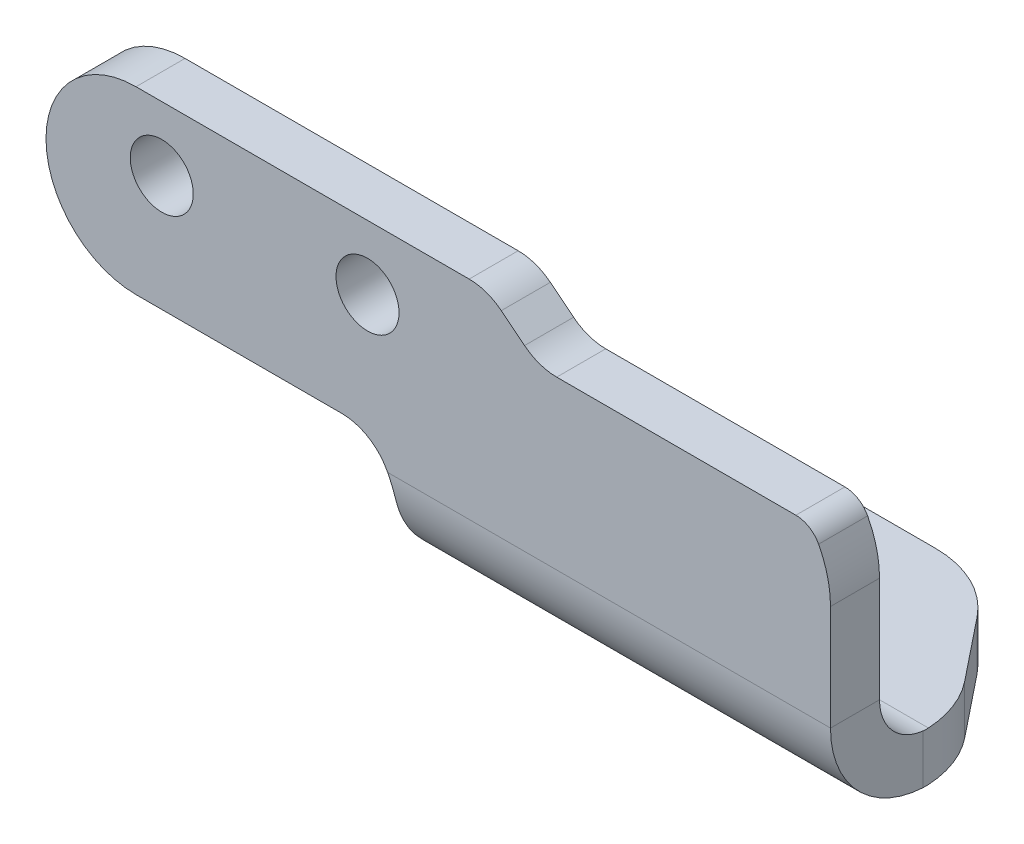
ISO-10303-21;
HEADER;
FILE_DESCRIPTION(('STEP AP214'),'2;1');
FILE_NAME('part.step','',(''),(''),'','','');
FILE_SCHEMA(('AUTOMOTIVE_DESIGN { 1 0 10303 214 1 1 1 1 }'));
ENDSEC;
DATA;
#1=APPLICATION_CONTEXT('core data for automotive mechanical design processes');
#2=APPLICATION_PROTOCOL_DEFINITION('international standard','automotive_design',2000,#1);
#3=PRODUCT_CONTEXT('',#1,'mechanical');
#4=PRODUCT('Part','Part','',(#3));
#5=PRODUCT_RELATED_PRODUCT_CATEGORY('part','',(#4));
#6=PRODUCT_DEFINITION_FORMATION('','',#4);
#7=PRODUCT_DEFINITION_CONTEXT('part definition',#1,'design');
#8=PRODUCT_DEFINITION('design','',#6,#7);
#9=PRODUCT_DEFINITION_SHAPE('','',#8);
#10=(LENGTH_UNIT() NAMED_UNIT(*) SI_UNIT(.MILLI.,.METRE.));
#11=(NAMED_UNIT(*) PLANE_ANGLE_UNIT() SI_UNIT($,.RADIAN.));
#12=(NAMED_UNIT(*) SI_UNIT($,.STERADIAN.) SOLID_ANGLE_UNIT());
#13=UNCERTAINTY_MEASURE_WITH_UNIT(LENGTH_MEASURE(1.E-05),#10,'distance_accuracy_value','');
#14=(GEOMETRIC_REPRESENTATION_CONTEXT(3) GLOBAL_UNCERTAINTY_ASSIGNED_CONTEXT((#13)) GLOBAL_UNIT_ASSIGNED_CONTEXT((#10,
#11,#12)) REPRESENTATION_CONTEXT('',''));
#15=CARTESIAN_POINT('',(0.,0.,0.));
#16=DIRECTION('',(0.,0.,1.));
#17=DIRECTION('',(1.,0.,0.));
#18=AXIS2_PLACEMENT_3D('',#15,#16,#17);
#19=CARTESIAN_POINT('',(-5.00000000000002,-5.00000000000001,9.53));
#20=DIRECTION('',(0.,0.,-1.));
#21=DIRECTION('',(-1.,0.,0.));
#22=AXIS2_PLACEMENT_3D('',#19,#20,#21);
#23=PLANE('',#22);
#24=CARTESIAN_POINT('',(40.,0.,9.53));
#25=DIRECTION('',(0.,0.,1.));
#26=DIRECTION('',(1.,0.,0.));
#27=AXIS2_PLACEMENT_3D('',#24,#25,#26);
#28=CIRCLE('',#27,6.125);
#29=CARTESIAN_POINT('',(46.125,0.,9.53));
#30=VERTEX_POINT('',#29);
#31=EDGE_CURVE('E276',#30,#30,#28,.T.);
#32=ORIENTED_EDGE('',*,*,#31,.F.);
#33=EDGE_LOOP('',(#32));
#34=FACE_BOUND('',#33,.T.);
#35=CARTESIAN_POINT('',(0.,0.,9.53));
#36=DIRECTION('',(0.,0.,1.));
#37=DIRECTION('',(1.,0.,0.));
#38=AXIS2_PLACEMENT_3D('',#35,#36,#37);
#39=CIRCLE('',#38,6.125);
#40=CARTESIAN_POINT('',(6.125,0.,9.53));
#41=VERTEX_POINT('',#40);
#42=EDGE_CURVE('E273',#41,#41,#39,.T.);
#43=ORIENTED_EDGE('',*,*,#42,.F.);
#44=EDGE_LOOP('',(#43));
#45=FACE_BOUND('',#44,.T.);
#46=DIRECTION('',(-1.,0.,0.));
#47=VECTOR('',#46,1.);
#48=CARTESIAN_POINT('',(45.,-27.97,9.53000000000001));
#49=LINE('',#48,#47);
#50=CARTESIAN_POINT('',(43.9151051592227,-27.97,9.53000000000001));
#51=VERTEX_POINT('',#50);
#52=CARTESIAN_POINT('',(130.,-27.97,9.53));
#53=VERTEX_POINT('',#52);
#54=EDGE_CURVE('E193',#51,#53,#49,.F.);
#55=ORIENTED_EDGE('',*,*,#54,.T.);
#56=DIRECTION('',(0.,1.,0.));
#57=VECTOR('',#56,1.);
#58=CARTESIAN_POINT('',(130.,-7.50000000000001,9.53));
#59=LINE('',#58,#57);
#60=CARTESIAN_POINT('',(130.,-7.50000000000001,9.53));
#61=VERTEX_POINT('',#60);
#62=EDGE_CURVE('E243',#53,#61,#59,.T.);
#63=ORIENTED_EDGE('',*,*,#62,.T.);
#64=CARTESIAN_POINT('',(110.,-7.50000000000001,9.53));
#65=DIRECTION('',(0.,0.,1.));
#66=DIRECTION('',(-1.,0.,0.));
#67=AXIS2_PLACEMENT_3D('',#64,#65,#66);
#68=CIRCLE('',#67,20.);
#69=CARTESIAN_POINT('',(127.688665548562,1.83333333333333,9.53));
#70=VERTEX_POINT('',#69);
#71=EDGE_CURVE('E245',#61,#70,#68,.T.);
#72=ORIENTED_EDGE('',*,*,#71,.T.);
#73=CARTESIAN_POINT('',(123.266499161422,-0.50000000000001,9.53));
#74=DIRECTION('',(0.,0.,1.));
#75=DIRECTION('',(-1.,0.,0.));
#76=AXIS2_PLACEMENT_3D('',#73,#74,#75);
#77=CIRCLE('',#76,4.99999999999999);
#78=CARTESIAN_POINT('',(123.266499161422,4.49999999999998,9.53));
#79=VERTEX_POINT('',#78);
#80=EDGE_CURVE('E249',#70,#79,#77,.T.);
#81=ORIENTED_EDGE('',*,*,#80,.T.);
#82=DIRECTION('',(-1.,0.,0.));
#83=VECTOR('',#82,1.);
#84=CARTESIAN_POINT('',(76.7743097550037,4.49999999999999,9.53));
#85=LINE('',#84,#83);
#86=CARTESIAN_POINT('',(76.7743097550037,4.49999999999999,9.53));
#87=VERTEX_POINT('',#86);
#88=EDGE_CURVE('E252',#79,#87,#85,.T.);
#89=ORIENTED_EDGE('',*,*,#88,.T.);
#90=CARTESIAN_POINT('',(76.7743097550037,14.5,9.53));
#91=DIRECTION('',(0.,0.,-1.));
#92=DIRECTION('',(-1.,0.,0.));
#93=AXIS2_PLACEMENT_3D('',#90,#91,#92);
#94=CIRCLE('',#93,10.);
#95=CARTESIAN_POINT('',(70.5273592794595,6.69131190556968,9.53));
#96=VERTEX_POINT('',#95);
#97=EDGE_CURVE('E255',#87,#96,#94,.T.);
#98=ORIENTED_EDGE('',*,*,#97,.T.);
#99=DIRECTION('',(-0.780868809443029,0.624695047554425,0.));
#100=VECTOR('',#99,1.);
#101=CARTESIAN_POINT('',(66.0056390433838,10.3086880944303,9.53));
#102=LINE('',#101,#100);
#103=CARTESIAN_POINT('',(66.0056390433838,10.3086880944303,9.53));
#104=VERTEX_POINT('',#103);
#105=EDGE_CURVE('E258',#96,#104,#102,.T.);
#106=ORIENTED_EDGE('',*,*,#105,.T.);
#107=CARTESIAN_POINT('',(59.7586885678395,2.49999999999999,9.53));
#108=DIRECTION('',(0.,0.,1.));
#109=DIRECTION('',(1.,0.,0.));
#110=AXIS2_PLACEMENT_3D('',#107,#108,#109);
#111=CIRCLE('',#110,10.);
#112=CARTESIAN_POINT('',(59.7586885678395,12.5,9.53));
#113=VERTEX_POINT('',#112);
#114=EDGE_CURVE('E261',#104,#113,#111,.T.);
#115=ORIENTED_EDGE('',*,*,#114,.T.);
#116=DIRECTION('',(-1.,0.,0.));
#117=VECTOR('',#116,1.);
#118=CARTESIAN_POINT('',(-5.,12.5,9.53));
#119=LINE('',#118,#117);
#120=CARTESIAN_POINT('',(-5.,12.5,9.53));
#121=VERTEX_POINT('',#120);
#122=EDGE_CURVE('E264',#113,#121,#119,.T.);
#123=ORIENTED_EDGE('',*,*,#122,.T.);
#124=CARTESIAN_POINT('',(-5.00000000000002,-5.00000000000001,9.53));
#125=DIRECTION('',(0.,0.,1.));
#126=DIRECTION('',(-1.,0.,0.));
#127=AXIS2_PLACEMENT_3D('',#124,#125,#126);
#128=CIRCLE('',#127,17.5);
#129=CARTESIAN_POINT('',(-5.00000000000001,-22.5,9.53));
#130=VERTEX_POINT('',#129);
#131=EDGE_CURVE('E267',#121,#130,#128,.T.);
#132=ORIENTED_EDGE('',*,*,#131,.T.);
#133=DIRECTION('',(1.,0.,0.));
#134=VECTOR('',#133,1.);
#135=CARTESIAN_POINT('',(45.,-22.5,9.53));
#136=LINE('',#135,#134);
#137=CARTESIAN_POINT('',(35.,-22.5,9.53));
#138=VERTEX_POINT('',#137);
#139=EDGE_CURVE('E270',#130,#138,#136,.T.);
#140=ORIENTED_EDGE('',*,*,#139,.T.);
#141=CARTESIAN_POINT('',(35.,-32.5,9.53));
#142=DIRECTION('',(0.,0.,-1.));
#143=DIRECTION('',(-1.,0.,0.));
#144=AXIS2_PLACEMENT_3D('',#141,#142,#143);
#145=CIRCLE('',#144,10.);
#146=EDGE_CURVE('E344',#138,#51,#145,.T.);
#147=ORIENTED_EDGE('',*,*,#146,.T.);
#148=EDGE_LOOP('',(#55,#63,#72,#81,#89,#98,#106,#115,#123,#132,#140,#147));
#149=FACE_BOUND('',#148,.T.);
#150=ADVANCED_FACE('F38',(#34,#45,#149),#23,.F.);
#151=CARTESIAN_POINT('',(-5.00000000000002,-5.00000000000001,0.));
#152=DIRECTION('',(0.,0.,-1.));
#153=DIRECTION('',(-1.,0.,0.));
#154=AXIS2_PLACEMENT_3D('',#151,#152,#153);
#155=PLANE('',#154);
#156=CARTESIAN_POINT('',(0.,0.,0.));
#157=DIRECTION('',(0.,0.,1.));
#158=DIRECTION('',(1.,0.,0.));
#159=AXIS2_PLACEMENT_3D('',#156,#157,#158);
#160=CIRCLE('',#159,6.125);
#161=CARTESIAN_POINT('',(6.125,0.,0.));
#162=VERTEX_POINT('',#161);
#163=EDGE_CURVE('E283',#162,#162,#160,.T.);
#164=ORIENTED_EDGE('',*,*,#163,.T.);
#165=EDGE_LOOP('',(#164));
#166=FACE_BOUND('',#165,.T.);
#167=CARTESIAN_POINT('',(40.,0.,0.));
#168=DIRECTION('',(0.,0.,1.));
#169=DIRECTION('',(1.,0.,0.));
#170=AXIS2_PLACEMENT_3D('',#167,#168,#169);
#171=CIRCLE('',#170,6.125);
#172=CARTESIAN_POINT('',(46.125,0.,0.));
#173=VERTEX_POINT('',#172);
#174=EDGE_CURVE('E246',#173,#173,#171,.T.);
#175=ORIENTED_EDGE('',*,*,#174,.T.);
#176=EDGE_LOOP('',(#175));
#177=FACE_BOUND('',#176,.T.);
#178=DIRECTION('',(0.,1.,0.));
#179=VECTOR('',#178,1.);
#180=CARTESIAN_POINT('',(130.,-5.00000000000001,0.));
#181=LINE('',#180,#179);
#182=CARTESIAN_POINT('',(130.,-27.97,0.));
#183=VERTEX_POINT('',#182);
#184=CARTESIAN_POINT('',(130.,-7.50000000000001,0.));
#185=VERTEX_POINT('',#184);
#186=EDGE_CURVE('E242',#183,#185,#181,.T.);
#187=ORIENTED_EDGE('',*,*,#186,.F.);
#188=DIRECTION('',(-1.,0.,0.));
#189=VECTOR('',#188,1.);
#190=CARTESIAN_POINT('',(45.,-27.97,0.));
#191=LINE('',#190,#189);
#192=CARTESIAN_POINT('',(43.9151051592227,-27.97,0.));
#193=VERTEX_POINT('',#192);
#194=EDGE_CURVE('E236',#193,#183,#191,.F.);
#195=ORIENTED_EDGE('',*,*,#194,.F.);
#196=CARTESIAN_POINT('',(35.,-32.5,0.));
#197=DIRECTION('',(0.,0.,-1.));
#198=DIRECTION('',(-1.,0.,0.));
#199=AXIS2_PLACEMENT_3D('',#196,#197,#198);
#200=CIRCLE('',#199,10.);
#201=CARTESIAN_POINT('',(35.,-22.5,0.));
#202=VERTEX_POINT('',#201);
#203=EDGE_CURVE('E399',#193,#202,#200,.F.);
#204=ORIENTED_EDGE('',*,*,#203,.T.);
#205=DIRECTION('',(-1.,0.,0.));
#206=VECTOR('',#205,1.);
#207=CARTESIAN_POINT('',(-5.00000000000002,-22.5,0.));
#208=LINE('',#207,#206);
#209=CARTESIAN_POINT('',(-5.00000000000001,-22.5,0.));
#210=VERTEX_POINT('',#209);
#211=EDGE_CURVE('E280',#210,#202,#208,.F.);
#212=ORIENTED_EDGE('',*,*,#211,.F.);
#213=CARTESIAN_POINT('',(-5.00000000000002,-5.00000000000001,0.));
#214=DIRECTION('',(0.,0.,1.));
#215=DIRECTION('',(1.,0.,0.));
#216=AXIS2_PLACEMENT_3D('',#213,#214,#215);
#217=CIRCLE('',#216,17.5);
#218=CARTESIAN_POINT('',(-5.,12.5,0.));
#219=VERTEX_POINT('',#218);
#220=EDGE_CURVE('E284',#219,#210,#217,.T.);
#221=ORIENTED_EDGE('',*,*,#220,.F.);
#222=DIRECTION('',(-1.,0.,0.));
#223=VECTOR('',#222,1.);
#224=CARTESIAN_POINT('',(-5.00000000000002,12.5,0.));
#225=LINE('',#224,#223);
#226=CARTESIAN_POINT('',(59.7586885678395,12.5,0.));
#227=VERTEX_POINT('',#226);
#228=EDGE_CURVE('E287',#227,#219,#225,.T.);
#229=ORIENTED_EDGE('',*,*,#228,.F.);
#230=CARTESIAN_POINT('',(59.7586885678395,2.49999999999999,0.));
#231=DIRECTION('',(0.,0.,1.));
#232=DIRECTION('',(1.,0.,0.));
#233=AXIS2_PLACEMENT_3D('',#230,#231,#232);
#234=CIRCLE('',#233,10.);
#235=CARTESIAN_POINT('',(66.0056390433838,10.3086880944303,0.));
#236=VERTEX_POINT('',#235);
#237=EDGE_CURVE('E290',#236,#227,#234,.T.);
#238=ORIENTED_EDGE('',*,*,#237,.F.);
#239=DIRECTION('',(-0.780868809443029,0.624695047554425,0.));
#240=VECTOR('',#239,1.);
#241=CARTESIAN_POINT('',(66.0056390433838,10.3086880944303,0.));
#242=LINE('',#241,#240);
#243=CARTESIAN_POINT('',(70.5273592794595,6.69131190556968,0.));
#244=VERTEX_POINT('',#243);
#245=EDGE_CURVE('E293',#244,#236,#242,.T.);
#246=ORIENTED_EDGE('',*,*,#245,.F.);
#247=CARTESIAN_POINT('',(76.7743097550037,14.5,0.));
#248=DIRECTION('',(0.,0.,-1.));
#249=DIRECTION('',(-1.,0.,0.));
#250=AXIS2_PLACEMENT_3D('',#247,#248,#249);
#251=CIRCLE('',#250,10.);
#252=CARTESIAN_POINT('',(76.7743097550037,4.49999999999999,0.));
#253=VERTEX_POINT('',#252);
#254=EDGE_CURVE('E296',#253,#244,#251,.T.);
#255=ORIENTED_EDGE('',*,*,#254,.F.);
#256=DIRECTION('',(-1.,0.,0.));
#257=VECTOR('',#256,1.);
#258=CARTESIAN_POINT('',(-5.00000000000002,4.49999999999998,0.));
#259=LINE('',#258,#257);
#260=CARTESIAN_POINT('',(123.266499161422,4.49999999999998,0.));
#261=VERTEX_POINT('',#260);
#262=EDGE_CURVE('E299',#261,#253,#259,.T.);
#263=ORIENTED_EDGE('',*,*,#262,.F.);
#264=CARTESIAN_POINT('',(123.266499161422,-0.50000000000001,0.));
#265=DIRECTION('',(0.,0.,1.));
#266=DIRECTION('',(1.,0.,0.));
#267=AXIS2_PLACEMENT_3D('',#264,#265,#266);
#268=CIRCLE('',#267,4.99999999999999);
#269=CARTESIAN_POINT('',(127.688665548562,1.83333333333333,0.));
#270=VERTEX_POINT('',#269);
#271=EDGE_CURVE('E302',#270,#261,#268,.T.);
#272=ORIENTED_EDGE('',*,*,#271,.F.);
#273=CARTESIAN_POINT('',(110.,-7.50000000000001,0.));
#274=DIRECTION('',(0.,0.,1.));
#275=DIRECTION('',(1.,0.,0.));
#276=AXIS2_PLACEMENT_3D('',#273,#274,#275);
#277=CIRCLE('',#276,20.);
#278=EDGE_CURVE('E305',#185,#270,#277,.T.);
#279=ORIENTED_EDGE('',*,*,#278,.F.);
#280=EDGE_LOOP('',(#187,#195,#204,#212,#221,#229,#238,#246,#255,#263,#272,#279));
#281=FACE_BOUND('',#280,.T.);
#282=ADVANCED_FACE('F418',(#166,#177,#281),#155,.T.);
#283=CARTESIAN_POINT('',(110.,-7.50000000000001,9.53));
#284=DIRECTION('',(0.,0.,-1.));
#285=DIRECTION('',(-1.,0.,0.));
#286=AXIS2_PLACEMENT_3D('',#283,#284,#285);
#287=CYLINDRICAL_SURFACE('',#286,20.);
#288=DIRECTION('',(0.,0.,1.));
#289=VECTOR('',#288,1.);
#290=CARTESIAN_POINT('',(130.,-7.50000000000001,9.53));
#291=LINE('',#290,#289);
#292=EDGE_CURVE('E328',#185,#61,#291,.T.);
#293=ORIENTED_EDGE('',*,*,#292,.F.);
#294=ORIENTED_EDGE('',*,*,#278,.T.);
#295=DIRECTION('',(0.,0.,1.));
#296=VECTOR('',#295,1.);
#297=CARTESIAN_POINT('',(127.688665548562,1.83333333333333,9.53));
#298=LINE('',#297,#296);
#299=EDGE_CURVE('E326',#270,#70,#298,.T.);
#300=ORIENTED_EDGE('',*,*,#299,.T.);
#301=ORIENTED_EDGE('',*,*,#71,.F.);
#302=EDGE_LOOP('',(#293,#294,#300,#301));
#303=FACE_BOUND('',#302,.T.);
#304=ADVANCED_FACE('F446',(#303),#287,.T.);
#305=CARTESIAN_POINT('',(123.266499161422,-0.50000000000001,9.53));
#306=DIRECTION('',(0.,0.,-1.));
#307=DIRECTION('',(-1.,0.,0.));
#308=AXIS2_PLACEMENT_3D('',#305,#306,#307);
#309=CYLINDRICAL_SURFACE('',#308,4.99999999999999);
#310=ORIENTED_EDGE('',*,*,#299,.F.);
#311=ORIENTED_EDGE('',*,*,#271,.T.);
#312=DIRECTION('',(0.,0.,1.));
#313=VECTOR('',#312,1.);
#314=CARTESIAN_POINT('',(123.266499161422,4.49999999999998,9.53));
#315=LINE('',#314,#313);
#316=EDGE_CURVE('E324',#261,#79,#315,.T.);
#317=ORIENTED_EDGE('',*,*,#316,.T.);
#318=ORIENTED_EDGE('',*,*,#80,.F.);
#319=EDGE_LOOP('',(#310,#311,#317,#318));
#320=FACE_BOUND('',#319,.T.);
#321=ADVANCED_FACE('F441',(#320),#309,.T.);
#322=CARTESIAN_POINT('',(76.7743097550037,4.49999999999999,9.53));
#323=DIRECTION('',(0.,-1.,0.));
#324=DIRECTION('',(-1.,0.,0.));
#325=AXIS2_PLACEMENT_3D('',#322,#323,#324);
#326=PLANE('',#325);
#327=ORIENTED_EDGE('',*,*,#316,.F.);
#328=ORIENTED_EDGE('',*,*,#262,.T.);
#329=DIRECTION('',(0.,0.,1.));
#330=VECTOR('',#329,1.);
#331=CARTESIAN_POINT('',(76.7743097550037,4.49999999999999,9.53));
#332=LINE('',#331,#330);
#333=EDGE_CURVE('E322',#253,#87,#332,.T.);
#334=ORIENTED_EDGE('',*,*,#333,.T.);
#335=ORIENTED_EDGE('',*,*,#88,.F.);
#336=EDGE_LOOP('',(#327,#328,#334,#335));
#337=FACE_BOUND('',#336,.T.);
#338=ADVANCED_FACE('F437',(#337),#326,.F.);
#339=CARTESIAN_POINT('',(76.7743097550037,14.5,9.53));
#340=DIRECTION('',(0.,0.,-1.));
#341=DIRECTION('',(-1.,0.,0.));
#342=AXIS2_PLACEMENT_3D('',#339,#340,#341);
#343=CYLINDRICAL_SURFACE('',#342,10.);
#344=ORIENTED_EDGE('',*,*,#333,.F.);
#345=ORIENTED_EDGE('',*,*,#254,.T.);
#346=DIRECTION('',(0.,0.,1.));
#347=VECTOR('',#346,1.);
#348=CARTESIAN_POINT('',(70.5273592794595,6.69131190556968,9.53));
#349=LINE('',#348,#347);
#350=EDGE_CURVE('E320',#244,#96,#349,.T.);
#351=ORIENTED_EDGE('',*,*,#350,.T.);
#352=ORIENTED_EDGE('',*,*,#97,.F.);
#353=EDGE_LOOP('',(#344,#345,#351,#352));
#354=FACE_BOUND('',#353,.T.);
#355=ADVANCED_FACE('F434',(#354),#343,.F.);
#356=CARTESIAN_POINT('',(66.0056390433838,10.3086880944303,9.53));
#357=DIRECTION('',(-0.624695047554425,-0.780868809443029,0.));
#358=DIRECTION('',(-0.780868809443029,0.624695047554425,0.));
#359=AXIS2_PLACEMENT_3D('',#356,#357,#358);
#360=PLANE('',#359);
#361=ORIENTED_EDGE('',*,*,#350,.F.);
#362=ORIENTED_EDGE('',*,*,#245,.T.);
#363=DIRECTION('',(0.,0.,1.));
#364=VECTOR('',#363,1.);
#365=CARTESIAN_POINT('',(66.0056390433838,10.3086880944303,9.53));
#366=LINE('',#365,#364);
#367=EDGE_CURVE('E318',#236,#104,#366,.T.);
#368=ORIENTED_EDGE('',*,*,#367,.T.);
#369=ORIENTED_EDGE('',*,*,#105,.F.);
#370=EDGE_LOOP('',(#361,#362,#368,#369));
#371=FACE_BOUND('',#370,.T.);
#372=ADVANCED_FACE('F429',(#371),#360,.F.);
#373=CARTESIAN_POINT('',(59.7586885678395,2.49999999999999,9.53));
#374=DIRECTION('',(0.,0.,-1.));
#375=DIRECTION('',(-1.,0.,0.));
#376=AXIS2_PLACEMENT_3D('',#373,#374,#375);
#377=CYLINDRICAL_SURFACE('',#376,10.);
#378=ORIENTED_EDGE('',*,*,#367,.F.);
#379=ORIENTED_EDGE('',*,*,#237,.T.);
#380=DIRECTION('',(0.,0.,1.));
#381=VECTOR('',#380,1.);
#382=CARTESIAN_POINT('',(59.7586885678395,12.5,9.53));
#383=LINE('',#382,#381);
#384=EDGE_CURVE('E316',#227,#113,#383,.T.);
#385=ORIENTED_EDGE('',*,*,#384,.T.);
#386=ORIENTED_EDGE('',*,*,#114,.F.);
#387=EDGE_LOOP('',(#378,#379,#385,#386));
#388=FACE_BOUND('',#387,.T.);
#389=ADVANCED_FACE('F425',(#388),#377,.T.);
#390=CARTESIAN_POINT('',(-5.,12.5,9.53));
#391=DIRECTION('',(0.,-1.,0.));
#392=DIRECTION('',(-1.,0.,0.));
#393=AXIS2_PLACEMENT_3D('',#390,#391,#392);
#394=PLANE('',#393);
#395=ORIENTED_EDGE('',*,*,#384,.F.);
#396=ORIENTED_EDGE('',*,*,#228,.T.);
#397=DIRECTION('',(0.,0.,1.));
#398=VECTOR('',#397,1.);
#399=CARTESIAN_POINT('',(-5.,12.5,9.53));
#400=LINE('',#399,#398);
#401=EDGE_CURVE('E314',#219,#121,#400,.T.);
#402=ORIENTED_EDGE('',*,*,#401,.T.);
#403=ORIENTED_EDGE('',*,*,#122,.F.);
#404=EDGE_LOOP('',(#395,#396,#402,#403));
#405=FACE_BOUND('',#404,.T.);
#406=ADVANCED_FACE('F422',(#405),#394,.F.);
#407=CARTESIAN_POINT('',(-5.00000000000002,-5.00000000000001,9.53));
#408=DIRECTION('',(0.,0.,-1.));
#409=DIRECTION('',(-1.,0.,0.));
#410=AXIS2_PLACEMENT_3D('',#407,#408,#409);
#411=CYLINDRICAL_SURFACE('',#410,17.5);
#412=ORIENTED_EDGE('',*,*,#401,.F.);
#413=ORIENTED_EDGE('',*,*,#220,.T.);
#414=DIRECTION('',(0.,0.,1.));
#415=VECTOR('',#414,1.);
#416=CARTESIAN_POINT('',(-5.00000000000001,-22.5,9.53));
#417=LINE('',#416,#415);
#418=EDGE_CURVE('E279',#210,#130,#417,.T.);
#419=ORIENTED_EDGE('',*,*,#418,.T.);
#420=ORIENTED_EDGE('',*,*,#131,.F.);
#421=EDGE_LOOP('',(#412,#413,#419,#420));
#422=FACE_BOUND('',#421,.T.);
#423=ADVANCED_FACE('F415',(#422),#411,.T.);
#424=CARTESIAN_POINT('',(45.,-22.5,9.53));
#425=DIRECTION('',(0.,1.,0.));
#426=DIRECTION('',(1.,0.,0.));
#427=AXIS2_PLACEMENT_3D('',#424,#425,#426);
#428=PLANE('',#427);
#429=ORIENTED_EDGE('',*,*,#211,.T.);
#430=DIRECTION('',(0.,0.,-1.));
#431=VECTOR('',#430,1.);
#432=CARTESIAN_POINT('',(35.,-22.5,9.53));
#433=LINE('',#432,#431);
#434=EDGE_CURVE('E331',#202,#138,#433,.F.);
#435=ORIENTED_EDGE('',*,*,#434,.T.);
#436=ORIENTED_EDGE('',*,*,#139,.F.);
#437=ORIENTED_EDGE('',*,*,#418,.F.);
#438=EDGE_LOOP('',(#429,#435,#436,#437));
#439=FACE_BOUND('',#438,.T.);
#440=ADVANCED_FACE('F410',(#439),#428,.F.);
#441=CARTESIAN_POINT('',(130.,-7.50000000000001,9.53));
#442=DIRECTION('',(-1.,0.,0.));
#443=DIRECTION('',(0.,1.,0.));
#444=AXIS2_PLACEMENT_3D('',#441,#442,#443);
#445=PLANE('',#444);
#446=DIRECTION('',(0.,0.,1.));
#447=VECTOR('',#446,1.);
#448=CARTESIAN_POINT('',(130.,-27.97,0.));
#449=LINE('',#448,#447);
#450=EDGE_CURVE('E232',#183,#53,#449,.T.);
#451=ORIENTED_EDGE('',*,*,#450,.F.);
#452=ORIENTED_EDGE('',*,*,#186,.T.);
#453=ORIENTED_EDGE('',*,*,#292,.T.);
#454=ORIENTED_EDGE('',*,*,#62,.F.);
#455=EDGE_LOOP('',(#451,#452,#453,#454));
#456=FACE_BOUND('',#455,.T.);
#457=ADVANCED_FACE('F449',(#456),#445,.F.);
#458=CARTESIAN_POINT('',(0.,0.,9.53));
#459=DIRECTION('',(0.,0.,-1.));
#460=DIRECTION('',(-1.,0.,0.));
#461=AXIS2_PLACEMENT_3D('',#458,#459,#460);
#462=CYLINDRICAL_SURFACE('',#461,6.125);
#463=ORIENTED_EDGE('',*,*,#42,.T.);
#464=EDGE_LOOP('',(#463));
#465=FACE_BOUND('',#464,.T.);
#466=ORIENTED_EDGE('',*,*,#163,.F.);
#467=EDGE_LOOP('',(#466));
#468=FACE_BOUND('',#467,.T.);
#469=ADVANCED_FACE('F509',(#465,#468),#462,.F.);
#470=CARTESIAN_POINT('',(40.,0.,9.53));
#471=DIRECTION('',(0.,0.,-1.));
#472=DIRECTION('',(-1.,0.,0.));
#473=AXIS2_PLACEMENT_3D('',#470,#471,#472);
#474=CYLINDRICAL_SURFACE('',#473,6.125);
#475=ORIENTED_EDGE('',*,*,#31,.T.);
#476=EDGE_LOOP('',(#475));
#477=FACE_BOUND('',#476,.T.);
#478=ORIENTED_EDGE('',*,*,#174,.F.);
#479=EDGE_LOOP('',(#478));
#480=FACE_BOUND('',#479,.T.);
#481=ADVANCED_FACE('F511',(#477,#480),#474,.F.);
#482=CARTESIAN_POINT('',(130.,-27.97,-9.53));
#483=DIRECTION('',(1.,0.,0.));
#484=DIRECTION('',(0.,1.,0.));
#485=AXIS2_PLACEMENT_3D('',#482,#483,#484);
#486=PLANE('',#485);
#487=CARTESIAN_POINT('',(130.,-27.97,-9.53));
#488=DIRECTION('',(-1.,0.,0.));
#489=DIRECTION('',(0.,-1.,0.));
#490=AXIS2_PLACEMENT_3D('',#487,#488,#489);
#491=CIRCLE('',#490,19.06);
#492=CARTESIAN_POINT('',(130.,-46.9996253000873,-8.45437881283561));
#493=VERTEX_POINT('',#492);
#494=EDGE_CURVE('E231',#53,#493,#491,.F.);
#495=ORIENTED_EDGE('',*,*,#494,.T.);
#496=DIRECTION('',(0.,-1.,0.));
#497=VECTOR('',#496,1.);
#498=CARTESIAN_POINT('',(130.,-27.97,-8.45437881283568));
#499=LINE('',#498,#497);
#500=CARTESIAN_POINT('',(130.,-37.4391044487704,-8.45437881283564));
#501=VERTEX_POINT('',#500);
#502=EDGE_CURVE('E379',#493,#501,#499,.F.);
#503=ORIENTED_EDGE('',*,*,#502,.T.);
#504=CARTESIAN_POINT('',(130.,-27.97,-9.53));
#505=DIRECTION('',(-1.,0.,0.));
#506=DIRECTION('',(0.,-1.,0.));
#507=AXIS2_PLACEMENT_3D('',#504,#505,#506);
#508=CIRCLE('',#507,9.53000000000001);
#509=EDGE_CURVE('E194',#183,#501,#508,.F.);
#510=ORIENTED_EDGE('',*,*,#509,.F.);
#511=ORIENTED_EDGE('',*,*,#450,.T.);
#512=EDGE_LOOP('',(#495,#503,#510,#511));
#513=FACE_BOUND('',#512,.T.);
#514=ADVANCED_FACE('F372',(#513),#486,.T.);
#515=CARTESIAN_POINT('',(45.,-27.97,-9.53));
#516=DIRECTION('',(1.,0.,0.));
#517=DIRECTION('',(0.,1.,0.));
#518=AXIS2_PLACEMENT_3D('',#515,#516,#517);
#519=PLANE('',#518);
#520=CARTESIAN_POINT('',(45.,-27.97,-9.53));
#521=DIRECTION('',(-1.,0.,0.));
#522=DIRECTION('',(0.,-1.,0.));
#523=AXIS2_PLACEMENT_3D('',#520,#521,#522);
#524=CIRCLE('',#523,19.06);
#525=CARTESIAN_POINT('',(45.,-47.03,-9.52999999999993));
#526=VERTEX_POINT('',#525);
#527=CARTESIAN_POINT('',(45.,-32.5,8.98385157118855));
#528=VERTEX_POINT('',#527);
#529=EDGE_CURVE('E184',#526,#528,#524,.T.);
#530=ORIENTED_EDGE('',*,*,#529,.T.);
#531=DIRECTION('',(0.,0.,-1.));
#532=VECTOR('',#531,1.);
#533=CARTESIAN_POINT('',(45.,-32.5,0.));
#534=LINE('',#533,#532);
#535=CARTESIAN_POINT('',(45.,-32.5,-1.14549047349813));
#536=VERTEX_POINT('',#535);
#537=EDGE_CURVE('E334',#528,#536,#534,.T.);
#538=ORIENTED_EDGE('',*,*,#537,.T.);
#539=CARTESIAN_POINT('',(45.,-27.97,-9.53));
#540=DIRECTION('',(-1.,0.,0.));
#541=DIRECTION('',(0.,-1.,0.));
#542=AXIS2_PLACEMENT_3D('',#539,#540,#541);
#543=CIRCLE('',#542,9.53000000000001);
#544=CARTESIAN_POINT('',(45.,-37.5000000000001,-9.52999999999997));
#545=VERTEX_POINT('',#544);
#546=EDGE_CURVE('E201',#545,#536,#543,.T.);
#547=ORIENTED_EDGE('',*,*,#546,.F.);
#548=DIRECTION('',(0.,-1.,0.));
#549=VECTOR('',#548,1.);
#550=CARTESIAN_POINT('',(45.,-37.5,-9.52999999999997));
#551=LINE('',#550,#549);
#552=EDGE_CURVE('E198',#545,#526,#551,.T.);
#553=ORIENTED_EDGE('',*,*,#552,.T.);
#554=EDGE_LOOP('',(#530,#538,#547,#553));
#555=FACE_BOUND('',#554,.T.);
#556=ADVANCED_FACE('F199',(#555),#519,.F.);
#557=CARTESIAN_POINT('',(45.,-27.97,-9.53));
#558=DIRECTION('',(-1.,0.,0.));
#559=DIRECTION('',(0.,-1.,0.));
#560=AXIS2_PLACEMENT_3D('',#557,#558,#559);
#561=CYLINDRICAL_SURFACE('',#560,19.06);
#562=DIRECTION('',(1.,0.,0.));
#563=VECTOR('',#562,1.);
#564=CARTESIAN_POINT('',(0.,-47.0300000000001,-9.52999999999993));
#565=LINE('',#564,#563);
#566=CARTESIAN_POINT('',(129.971055031263,-47.03,-9.52999999999993));
#567=VERTEX_POINT('',#566);
#568=EDGE_CURVE('E188',#526,#567,#565,.T.);
#569=ORIENTED_EDGE('',*,*,#568,.T.);
#570=CARTESIAN_POINT('',(129.971055031263,-47.03,-9.52999999999993));
#571=CARTESIAN_POINT('',(129.98070632665,-47.0300026557723,-9.35071666570524));
#572=CARTESIAN_POINT('',(129.987944055071,-47.0274727586656,-9.17143989962754));
#573=CARTESIAN_POINT('',(129.997592377983,-47.0173478586947,-8.81289950390609));
#574=CARTESIAN_POINT('',(130.000002972474,-47.0097528558305,-8.63363587426236));
#575=CARTESIAN_POINT('',(130.,-46.9996253000873,-8.45437881283561));
#576=B_SPLINE_CURVE_WITH_KNOTS('',3,(#570,#571,#572,#573,#574,#575),.UNSPECIFIED.,.F.,.F.,(4,2,
4),(0.,0.538321925548449,1.0766438510969),.UNSPECIFIED.);
#577=EDGE_CURVE('E11',#567,#493,#576,.T.);
#578=ORIENTED_EDGE('',*,*,#577,.T.);
#579=ORIENTED_EDGE('',*,*,#494,.F.);
#580=ORIENTED_EDGE('',*,*,#54,.F.);
#581=CARTESIAN_POINT('',(43.9151051592227,-27.97,9.53000000000001));
#582=CARTESIAN_POINT('',(44.0317019906566,-28.1993729642455,9.53003577953231));
#583=CARTESIAN_POINT('',(44.1393827710857,-28.4333009102528,9.52586095375912));
#584=CARTESIAN_POINT('',(44.3363493446987,-28.9085450935439,9.5083541921857));
#585=CARTESIAN_POINT('',(44.4256282008556,-29.1498640778178,9.49501881128219));
#586=CARTESIAN_POINT('',(44.5834036721747,-29.6326817596098,9.45885178845755));
#587=CARTESIAN_POINT('',(44.6523102850206,-29.8740622513476,9.43623312893395));
#588=CARTESIAN_POINT('',(44.7715669198124,-30.3601225674976,9.38112655677044));
#589=CARTESIAN_POINT('',(44.8219252993136,-30.6048008543291,9.34864310112714));
#590=CARTESIAN_POINT('',(44.9086442489867,-31.12328944908,9.2693766190758));
#591=CARTESIAN_POINT('',(44.9428046732417,-31.3972925920754,9.22139931993472));
#592=CARTESIAN_POINT('',(44.9771005228079,-31.8094737185923,9.13981624086318));
#593=CARTESIAN_POINT('',(44.9857078300325,-31.9479271684928,9.11080822765657));
#594=CARTESIAN_POINT('',(44.9971576537218,-32.2243729709808,9.04966509567778));
#595=CARTESIAN_POINT('',(45.0000005182689,-32.3623653509074,9.01753016584538));
#596=CARTESIAN_POINT('',(45.,-32.5,8.98385157118855));
#597=B_SPLINE_CURVE_WITH_KNOTS('',3,(#581,#582,#583,#584,#585,#586,#587,#588,#589,#590,#591,
#592,#593,#594,#595,#596),.UNSPECIFIED.,.F.,.F.,(4,2,2,2,2,2,2,4),(0.,0.771724826466216,
1.54374004235792,2.29895394803286,3.0538271481672,3.89326692286852,4.31830036902358,
4.74330814902713),.UNSPECIFIED.);
#598=EDGE_CURVE('E190',#51,#528,#597,.T.);
#599=ORIENTED_EDGE('',*,*,#598,.T.);
#600=ORIENTED_EDGE('',*,*,#529,.F.);
#601=EDGE_LOOP('',(#569,#578,#579,#580,#599,#600));
#602=FACE_BOUND('',#601,.T.);
#603=ADVANCED_FACE('F186',(#602),#561,.T.);
#604=CARTESIAN_POINT('',(45.,-27.97,-9.53));
#605=DIRECTION('',(-1.,0.,0.));
#606=DIRECTION('',(0.,-1.,0.));
#607=AXIS2_PLACEMENT_3D('',#604,#605,#606);
#608=CYLINDRICAL_SURFACE('',#607,9.53000000000001);
#609=ORIENTED_EDGE('',*,*,#509,.T.);
#610=CARTESIAN_POINT('',(130.,-37.4391044487704,-8.45437881283564));
#611=CARTESIAN_POINT('',(130.00001456454,-37.45940219318,-8.63320467130063));
#612=CARTESIAN_POINT('',(129.997609766081,-37.474625694654,-8.81225269946362));
#613=CARTESIAN_POINT('',(129.987961443169,-37.4949242117305,-9.17079309518506));
#614=CARTESIAN_POINT('',(129.980717918715,-37.4999992273331,-9.35028546274352));
#615=CARTESIAN_POINT('',(129.971055031263,-37.5,-9.52999999999996));
#616=B_SPLINE_CURVE_WITH_KNOTS('',3,(#610,#611,#612,#613,#614,#615),.UNSPECIFIED.,.F.,.F.,(4,2,
4),(0.,0.539130420191855,1.0782608403822),.UNSPECIFIED.);
#617=CARTESIAN_POINT('',(129.971055031263,-37.5,-9.52999999999997));
#618=VERTEX_POINT('',#617);
#619=EDGE_CURVE('E51',#501,#618,#616,.T.);
#620=ORIENTED_EDGE('',*,*,#619,.T.);
#621=DIRECTION('',(-1.,0.,0.));
#622=VECTOR('',#621,1.);
#623=CARTESIAN_POINT('',(130.,-37.5,-9.52999999999997));
#624=LINE('',#623,#622);
#625=EDGE_CURVE('E206',#618,#545,#624,.T.);
#626=ORIENTED_EDGE('',*,*,#625,.T.);
#627=ORIENTED_EDGE('',*,*,#546,.T.);
#628=CARTESIAN_POINT('',(45.,-32.5,-1.14549047349813));
#629=CARTESIAN_POINT('',(45.000034303303,-32.3171756146033,-1.04666640422608));
#630=CARTESIAN_POINT('',(44.9949872124958,-32.1310405708281,-0.953873391777174));
#631=CARTESIAN_POINT('',(44.9738864851084,-31.7535746556312,-0.780807310586054));
#632=CARTESIAN_POINT('',(44.9578291214477,-31.5622420458543,-0.70053849269916));
#633=CARTESIAN_POINT('',(44.9144840039073,-31.1813894376944,-0.555129739065279));
#634=CARTESIAN_POINT('',(44.8875263529324,-30.9919709503651,-0.489626446095878));
#635=CARTESIAN_POINT('',(44.8219174240783,-30.6112914951808,-0.371168667879038));
#636=CARTESIAN_POINT('',(44.7832690204559,-30.4200309913763,-0.318211103872711));
#637=CARTESIAN_POINT('',(44.6945053284356,-30.0394501464045,-0.22536658277751));
#638=CARTESIAN_POINT('',(44.6445270207234,-29.8501327876202,-0.185336317097881));
#639=CARTESIAN_POINT('',(44.5328179816221,-29.4727694793874,-0.11727654444518));
#640=CARTESIAN_POINT('',(44.4710846208366,-29.28472382416,-0.0892497269959335));
#641=CARTESIAN_POINT('',(44.3341016163803,-28.9060911982891,-0.0441166901368115));
#642=CARTESIAN_POINT('',(44.2585145354108,-28.7155864890043,-0.0273474412044532));
#643=CARTESIAN_POINT('',(44.0955475214207,-28.3390748851296,-0.00527412751037723));
#644=CARTESIAN_POINT('',(44.0081713953232,-28.1530665613353,3.3629030904456E-05));
#645=CARTESIAN_POINT('',(43.9151051592228,-27.97,0.));
#646=B_SPLINE_CURVE_WITH_KNOTS('',3,(#628,#629,#630,#631,#632,#633,#634,#635,#636,#637,#638,
#639,#640,#641,#642,#643,#644,#645),.UNSPECIFIED.,.F.,.F.,(4,2,2,2,2,2,2,2,4),(0.,
0.623367190737466,1.24694550134683,1.85290620389799,2.4587180475068,3.05756304218496,
3.6565421455216,4.27273412476645,4.88872759718383),.UNSPECIFIED.);
#647=EDGE_CURVE('E352',#536,#193,#646,.T.);
#648=ORIENTED_EDGE('',*,*,#647,.T.);
#649=ORIENTED_EDGE('',*,*,#194,.T.);
#650=EDGE_LOOP('',(#609,#620,#626,#627,#648,#649));
#651=FACE_BOUND('',#650,.T.);
#652=ADVANCED_FACE('F365',(#651),#608,.F.);
#653=CARTESIAN_POINT('',(45.,-47.0300000000001,-40.47));
#654=DIRECTION('',(1.,0.,0.));
#655=DIRECTION('',(0.,1.,0.));
#656=AXIS2_PLACEMENT_3D('',#653,#654,#655);
#657=PLANE('',#656);
#658=DIRECTION('',(0.,0.,-1.));
#659=VECTOR('',#658,1.);
#660=CARTESIAN_POINT('',(45.,-37.5000000000001,-40.47));
#661=LINE('',#660,#659);
#662=CARTESIAN_POINT('',(45.,-37.5000000000001,-30.47));
#663=VERTEX_POINT('',#662);
#664=EDGE_CURVE('E217',#545,#663,#661,.T.);
#665=ORIENTED_EDGE('',*,*,#664,.T.);
#666=DIRECTION('',(0.,1.,0.));
#667=VECTOR('',#666,1.);
#668=CARTESIAN_POINT('',(45.,-47.0300000000001,-30.47));
#669=LINE('',#668,#667);
#670=CARTESIAN_POINT('',(45.,-47.0300000000001,-30.47));
#671=VERTEX_POINT('',#670);
#672=EDGE_CURVE('E221',#663,#671,#669,.F.);
#673=ORIENTED_EDGE('',*,*,#672,.T.);
#674=DIRECTION('',(0.,0.,-1.));
#675=VECTOR('',#674,1.);
#676=CARTESIAN_POINT('',(45.,-47.0300000000001,-40.47));
#677=LINE('',#676,#675);
#678=EDGE_CURVE('E212',#526,#671,#677,.T.);
#679=ORIENTED_EDGE('',*,*,#678,.F.);
#680=ORIENTED_EDGE('',*,*,#552,.F.);
#681=EDGE_LOOP('',(#665,#673,#679,#680));
#682=FACE_BOUND('',#681,.T.);
#683=ADVANCED_FACE('F219',(#682),#657,.F.);
#684=CARTESIAN_POINT('',(0.,-47.03,1.61867106705269E-13));
#685=DIRECTION('',(0.,1.,0.));
#686=DIRECTION('',(0.,0.,1.));
#687=AXIS2_PLACEMENT_3D('',#684,#685,#686);
#688=PLANE('',#687);
#689=DIRECTION('',(1.,0.,0.));
#690=VECTOR('',#689,1.);
#691=CARTESIAN_POINT('',(130.,-47.0300000000001,-40.47));
#692=LINE('',#691,#690);
#693=CARTESIAN_POINT('',(55.,-47.0300000000001,-40.47));
#694=VERTEX_POINT('',#693);
#695=CARTESIAN_POINT('',(100.387503050269,-47.0300000000001,-40.47));
#696=VERTEX_POINT('',#695);
#697=EDGE_CURVE('E222',#694,#696,#692,.T.);
#698=ORIENTED_EDGE('',*,*,#697,.T.);
#699=CARTESIAN_POINT('',(100.387503050269,-47.0300000000001,-20.47));
#700=DIRECTION('',(0.,1.,0.));
#701=DIRECTION('',(0.,0.,1.));
#702=AXIS2_PLACEMENT_3D('',#699,#700,#701);
#703=CIRCLE('',#702,20.);
#704=CARTESIAN_POINT('',(116.004879239129,-47.0300000000001,-32.9639009510884));
#705=VERTEX_POINT('',#704);
#706=EDGE_CURVE('E389',#696,#705,#703,.F.);
#707=ORIENTED_EDGE('',*,*,#706,.T.);
#708=DIRECTION('',(-0.624695047554423,0.,-0.780868809443031));
#709=VECTOR('',#708,1.);
#710=CARTESIAN_POINT('',(130.,-47.0300000000001,-15.4699999999998));
#711=LINE('',#710,#709);
#712=CARTESIAN_POINT('',(125.617376188861,-47.0300000000001,-20.9482797639241));
#713=VERTEX_POINT('',#712);
#714=EDGE_CURVE('E395',#705,#713,#711,.F.);
#715=ORIENTED_EDGE('',*,*,#714,.T.);
#716=CARTESIAN_POINT('',(110.,-47.03,-8.45437881283561));
#717=DIRECTION('',(0.,1.,0.));
#718=DIRECTION('',(0.,0.,1.));
#719=AXIS2_PLACEMENT_3D('',#716,#717,#718);
#720=CIRCLE('',#719,20.);
#721=EDGE_CURVE('E216',#713,#567,#720,.F.);
#722=ORIENTED_EDGE('',*,*,#721,.T.);
#723=ORIENTED_EDGE('',*,*,#568,.F.);
#724=ORIENTED_EDGE('',*,*,#678,.T.);
#725=CARTESIAN_POINT('',(55.,-47.0300000000001,-30.47));
#726=DIRECTION('',(0.,1.,0.));
#727=DIRECTION('',(0.,0.,1.));
#728=AXIS2_PLACEMENT_3D('',#725,#726,#727);
#729=CIRCLE('',#728,10.);
#730=EDGE_CURVE('E342',#671,#694,#729,.F.);
#731=ORIENTED_EDGE('',*,*,#730,.T.);
#732=EDGE_LOOP('',(#698,#707,#715,#722,#723,#724,#731));
#733=FACE_BOUND('',#732,.T.);
#734=ADVANCED_FACE('F211',(#733),#688,.F.);
#735=CARTESIAN_POINT('',(0.,-37.5,1.28593289546094E-13));
#736=DIRECTION('',(0.,1.,0.));
#737=DIRECTION('',(0.,0.,1.));
#738=AXIS2_PLACEMENT_3D('',#735,#736,#737);
#739=PLANE('',#738);
#740=DIRECTION('',(0.624695047554423,0.,0.780868809443031));
#741=VECTOR('',#740,1.);
#742=CARTESIAN_POINT('',(86.8146341463416,-37.5000000000002,-69.451707317073));
#743=LINE('',#742,#741);
#744=CARTESIAN_POINT('',(125.617376188861,-37.5000000000001,-20.9482797639241));
#745=VERTEX_POINT('',#744);
#746=CARTESIAN_POINT('',(116.004879239129,-37.5000000000001,-32.9639009510885));
#747=VERTEX_POINT('',#746);
#748=EDGE_CURVE('E397',#745,#747,#743,.F.);
#749=ORIENTED_EDGE('',*,*,#748,.T.);
#750=CARTESIAN_POINT('',(100.387503050269,-37.5000000000001,-20.47));
#751=DIRECTION('',(0.,1.,0.));
#752=DIRECTION('',(0.,0.,1.));
#753=AXIS2_PLACEMENT_3D('',#750,#751,#752);
#754=CIRCLE('',#753,20.);
#755=CARTESIAN_POINT('',(100.387503050269,-37.5000000000001,-40.47));
#756=VERTEX_POINT('',#755);
#757=EDGE_CURVE('E381',#747,#756,#754,.T.);
#758=ORIENTED_EDGE('',*,*,#757,.T.);
#759=DIRECTION('',(1.,0.,0.));
#760=VECTOR('',#759,1.);
#761=CARTESIAN_POINT('',(130.,-37.5000000000001,-40.47));
#762=LINE('',#761,#760);
#763=CARTESIAN_POINT('',(55.,-37.5000000000001,-40.47));
#764=VERTEX_POINT('',#763);
#765=EDGE_CURVE('E223',#764,#756,#762,.T.);
#766=ORIENTED_EDGE('',*,*,#765,.F.);
#767=CARTESIAN_POINT('',(55.,-37.5000000000001,-30.47));
#768=DIRECTION('',(0.,1.,0.));
#769=DIRECTION('',(0.,0.,1.));
#770=AXIS2_PLACEMENT_3D('',#767,#768,#769);
#771=CIRCLE('',#770,10.);
#772=EDGE_CURVE('E339',#764,#663,#771,.T.);
#773=ORIENTED_EDGE('',*,*,#772,.T.);
#774=ORIENTED_EDGE('',*,*,#664,.F.);
#775=ORIENTED_EDGE('',*,*,#625,.F.);
#776=CARTESIAN_POINT('',(110.,-37.5,-8.45437881283564));
#777=DIRECTION('',(0.,1.,0.));
#778=DIRECTION('',(0.,0.,1.));
#779=AXIS2_PLACEMENT_3D('',#776,#777,#778);
#780=CIRCLE('',#779,20.);
#781=EDGE_CURVE('E383',#618,#745,#780,.T.);
#782=ORIENTED_EDGE('',*,*,#781,.T.);
#783=EDGE_LOOP('',(#749,#758,#766,#773,#774,#775,#782));
#784=FACE_BOUND('',#783,.T.);
#785=ADVANCED_FACE('F453',(#784),#739,.T.);
#786=CARTESIAN_POINT('',(130.,-47.0300000000001,-40.47));
#787=DIRECTION('',(0.,0.,1.));
#788=DIRECTION('',(0.,-1.,0.));
#789=AXIS2_PLACEMENT_3D('',#786,#787,#788);
#790=PLANE('',#789);
#791=ORIENTED_EDGE('',*,*,#765,.T.);
#792=DIRECTION('',(0.,1.,0.));
#793=VECTOR('',#792,1.);
#794=CARTESIAN_POINT('',(100.387503050269,-47.0300000000001,-40.47));
#795=LINE('',#794,#793);
#796=EDGE_CURVE('E392',#756,#696,#795,.F.);
#797=ORIENTED_EDGE('',*,*,#796,.T.);
#798=ORIENTED_EDGE('',*,*,#697,.F.);
#799=DIRECTION('',(0.,1.,0.));
#800=VECTOR('',#799,1.);
#801=CARTESIAN_POINT('',(55.,-47.0300000000001,-40.47));
#802=LINE('',#801,#800);
#803=EDGE_CURVE('E336',#694,#764,#802,.T.);
#804=ORIENTED_EDGE('',*,*,#803,.T.);
#805=EDGE_LOOP('',(#791,#797,#798,#804));
#806=FACE_BOUND('',#805,.T.);
#807=ADVANCED_FACE('F467',(#806),#790,.F.);
#808=CARTESIAN_POINT('',(35.,-32.5,9.53));
#809=DIRECTION('',(0.,0.,-1.));
#810=DIRECTION('',(-1.,0.,0.));
#811=AXIS2_PLACEMENT_3D('',#808,#809,#810);
#812=CYLINDRICAL_SURFACE('',#811,10.);
#813=ORIENTED_EDGE('',*,*,#647,.F.);
#814=ORIENTED_EDGE('',*,*,#537,.F.);
#815=ORIENTED_EDGE('',*,*,#598,.F.);
#816=ORIENTED_EDGE('',*,*,#146,.F.);
#817=ORIENTED_EDGE('',*,*,#434,.F.);
#818=ORIENTED_EDGE('',*,*,#203,.F.);
#819=EDGE_LOOP('',(#813,#814,#815,#816,#817,#818));
#820=FACE_BOUND('',#819,.T.);
#821=ADVANCED_FACE('F358',(#820),#812,.F.);
#822=CARTESIAN_POINT('',(55.,-47.0300000000001,-30.47));
#823=DIRECTION('',(0.,1.,0.));
#824=DIRECTION('',(0.,0.,1.));
#825=AXIS2_PLACEMENT_3D('',#822,#823,#824);
#826=CYLINDRICAL_SURFACE('',#825,10.);
#827=ORIENTED_EDGE('',*,*,#730,.F.);
#828=ORIENTED_EDGE('',*,*,#672,.F.);
#829=ORIENTED_EDGE('',*,*,#772,.F.);
#830=ORIENTED_EDGE('',*,*,#803,.F.);
#831=EDGE_LOOP('',(#827,#828,#829,#830));
#832=FACE_BOUND('',#831,.T.);
#833=ADVANCED_FACE('F471',(#832),#826,.T.);
#834=CARTESIAN_POINT('',(130.,-47.03,-15.4699999999998));
#835=DIRECTION('',(-0.780868809443031,0.,0.624695047554423));
#836=DIRECTION('',(0.,1.,0.));
#837=AXIS2_PLACEMENT_3D('',#834,#835,#836);
#838=PLANE('',#837);
#839=ORIENTED_EDGE('',*,*,#714,.F.);
#840=DIRECTION('',(0.,-1.,0.));
#841=VECTOR('',#840,1.);
#842=CARTESIAN_POINT('',(116.004879239129,-37.5000000000001,-32.9639009510885));
#843=LINE('',#842,#841);
#844=EDGE_CURVE('E385',#705,#747,#843,.F.);
#845=ORIENTED_EDGE('',*,*,#844,.T.);
#846=ORIENTED_EDGE('',*,*,#748,.F.);
#847=DIRECTION('',(0.,1.,0.));
#848=VECTOR('',#847,1.);
#849=CARTESIAN_POINT('',(125.617376188861,-47.0300000000001,-20.9482797639241));
#850=LINE('',#849,#848);
#851=EDGE_CURVE('E387',#745,#713,#850,.F.);
#852=ORIENTED_EDGE('',*,*,#851,.T.);
#853=EDGE_LOOP('',(#839,#845,#846,#852));
#854=FACE_BOUND('',#853,.T.);
#855=ADVANCED_FACE('F459',(#854),#838,.F.);
#856=CARTESIAN_POINT('',(100.387503050269,-47.0300000000001,-20.47));
#857=DIRECTION('',(0.,-1.,0.));
#858=DIRECTION('',(0.,0.,-1.));
#859=AXIS2_PLACEMENT_3D('',#856,#857,#858);
#860=CYLINDRICAL_SURFACE('',#859,20.);
#861=ORIENTED_EDGE('',*,*,#757,.F.);
#862=ORIENTED_EDGE('',*,*,#844,.F.);
#863=ORIENTED_EDGE('',*,*,#706,.F.);
#864=ORIENTED_EDGE('',*,*,#796,.F.);
#865=EDGE_LOOP('',(#861,#862,#863,#864));
#866=FACE_BOUND('',#865,.T.);
#867=ADVANCED_FACE('F465',(#866),#860,.T.);
#868=CARTESIAN_POINT('',(110.,-27.97,-8.45437881283568));
#869=DIRECTION('',(0.,-1.,0.));
#870=DIRECTION('',(0.,0.,-1.));
#871=AXIS2_PLACEMENT_3D('',#868,#869,#870);
#872=CYLINDRICAL_SURFACE('',#871,20.);
#873=ORIENTED_EDGE('',*,*,#721,.F.);
#874=ORIENTED_EDGE('',*,*,#851,.F.);
#875=ORIENTED_EDGE('',*,*,#781,.F.);
#876=ORIENTED_EDGE('',*,*,#619,.F.);
#877=ORIENTED_EDGE('',*,*,#502,.F.);
#878=ORIENTED_EDGE('',*,*,#577,.F.);
#879=EDGE_LOOP('',(#873,#874,#875,#876,#877,#878));
#880=FACE_BOUND('',#879,.T.);
#881=ADVANCED_FACE('F40',(#880),#872,.T.);
#882=CLOSED_SHELL('',(#150,#282,#304,#321,#338,#355,#372,#389,#406,#423,#440,#457,#469,#481,
#514,#556,#603,#652,#683,#734,#785,#807,#821,#833,#855,#867,#881));
#883=MANIFOLD_SOLID_BREP('B2',#882);
#884=ADVANCED_BREP_SHAPE_REPRESENTATION('',(#18,#883),#14);
#885=SHAPE_DEFINITION_REPRESENTATION(#9,#884);
ENDSEC;
END-ISO-10303-21;
